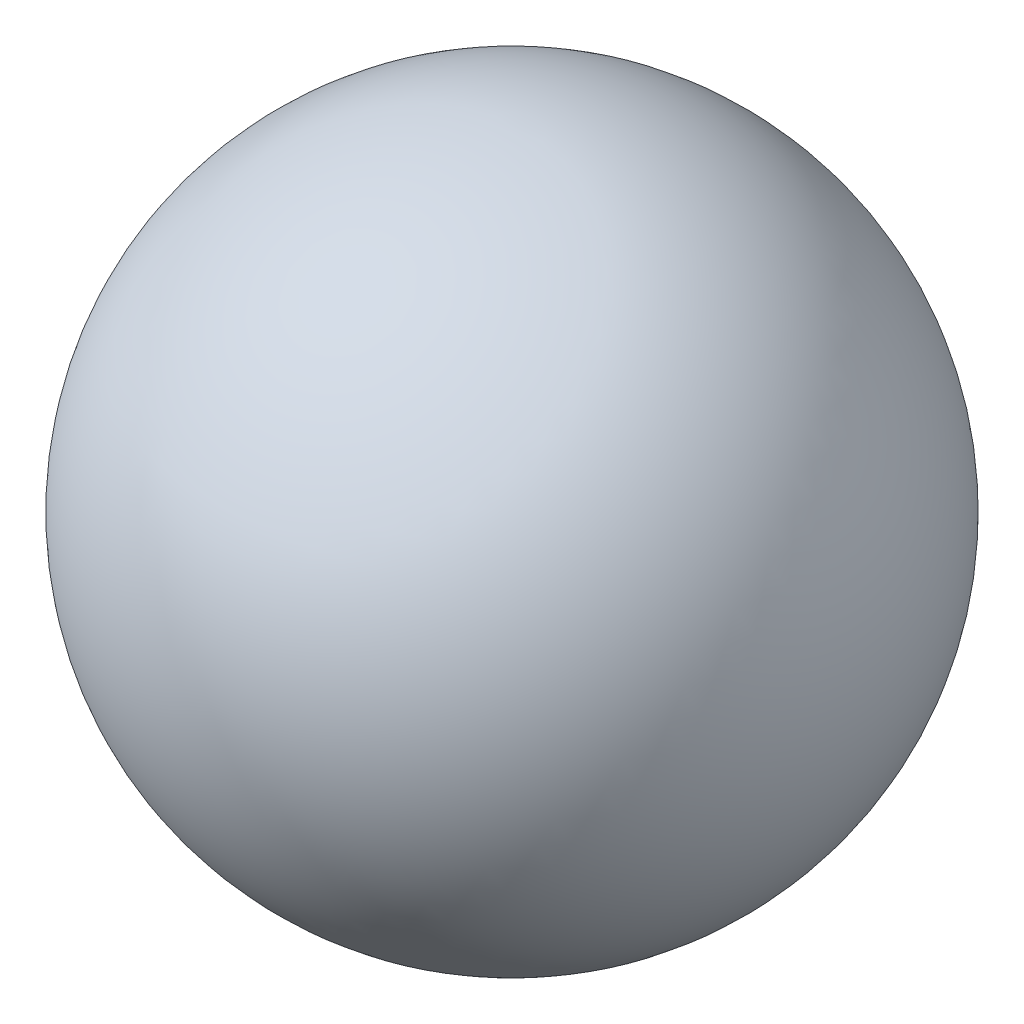
ISO-10303-21;
HEADER;
FILE_DESCRIPTION(('STEP AP214'),'2;1');
FILE_NAME('part.step','',(''),(''),'','','');
FILE_SCHEMA(('AUTOMOTIVE_DESIGN { 1 0 10303 214 1 1 1 1 }'));
ENDSEC;
DATA;
#1=APPLICATION_CONTEXT('core data for automotive mechanical design processes');
#2=APPLICATION_PROTOCOL_DEFINITION('international standard','automotive_design',2000,#1);
#3=PRODUCT_CONTEXT('',#1,'mechanical');
#4=PRODUCT('Part','Part','',(#3));
#5=PRODUCT_RELATED_PRODUCT_CATEGORY('part','',(#4));
#6=PRODUCT_DEFINITION_FORMATION('','',#4);
#7=PRODUCT_DEFINITION_CONTEXT('part definition',#1,'design');
#8=PRODUCT_DEFINITION('design','',#6,#7);
#9=PRODUCT_DEFINITION_SHAPE('','',#8);
#10=(LENGTH_UNIT() NAMED_UNIT(*) SI_UNIT(.MILLI.,.METRE.));
#11=(NAMED_UNIT(*) PLANE_ANGLE_UNIT() SI_UNIT($,.RADIAN.));
#12=(NAMED_UNIT(*) SI_UNIT($,.STERADIAN.) SOLID_ANGLE_UNIT());
#13=UNCERTAINTY_MEASURE_WITH_UNIT(LENGTH_MEASURE(1.E-05),#10,'distance_accuracy_value','');
#14=(GEOMETRIC_REPRESENTATION_CONTEXT(3) GLOBAL_UNCERTAINTY_ASSIGNED_CONTEXT((#13)) GLOBAL_UNIT_ASSIGNED_CONTEXT((#10,
#11,#12)) REPRESENTATION_CONTEXT('',''));
#15=CARTESIAN_POINT('',(0.,0.,0.));
#16=DIRECTION('',(0.,0.,1.));
#17=DIRECTION('',(1.,0.,0.));
#18=AXIS2_PLACEMENT_3D('',#15,#16,#17);
#19=CARTESIAN_POINT('',(0.,0.,0.));
#20=DIRECTION('',(0.,1.,0.));
#21=DIRECTION('',(0.,0.,-1.));
#22=AXIS2_PLACEMENT_3D('',#19,#20,#21);
#23=SPHERICAL_SURFACE('',#22,11.15);
#24=CARTESIAN_POINT('',(0.,11.15,0.));
#25=VERTEX_POINT('',#24);
#26=VERTEX_LOOP('',#25);
#27=FACE_BOUND('',#26,.T.);
#28=ADVANCED_FACE('F30',(#27),#23,.T.);
#29=CLOSED_SHELL('',(#28));
#30=MANIFOLD_SOLID_BREP('B2',#29);
#31=ADVANCED_BREP_SHAPE_REPRESENTATION('',(#18,#30),#14);
#32=SHAPE_DEFINITION_REPRESENTATION(#9,#31);
ENDSEC;
END-ISO-10303-21;
